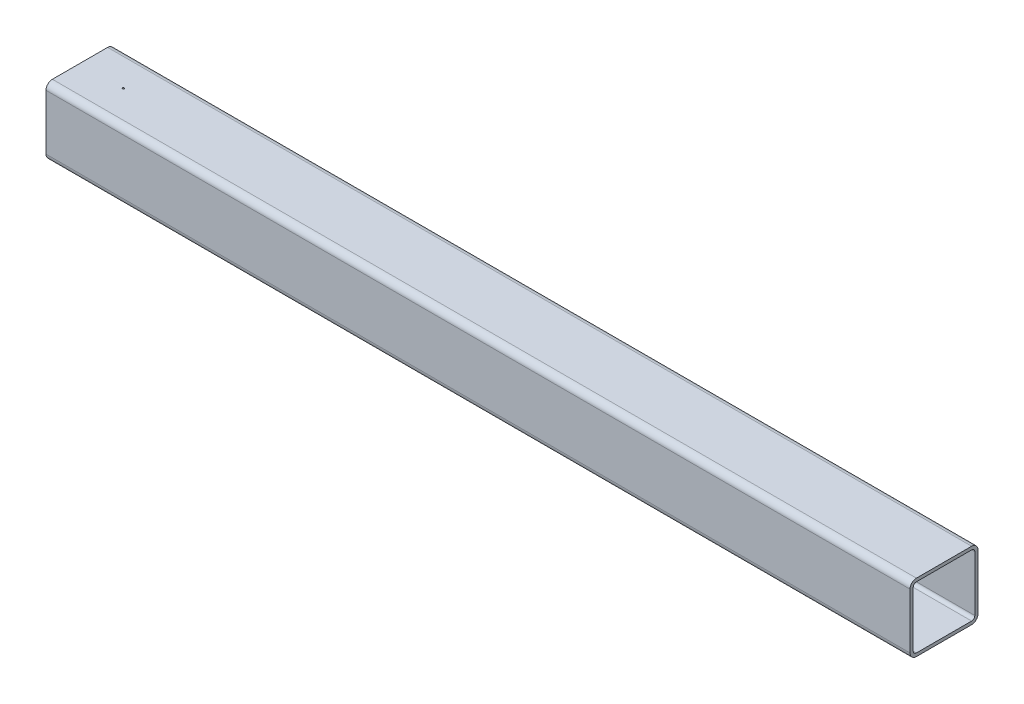
ISO-10303-21;
HEADER;
FILE_DESCRIPTION(('STEP AP214'),'2;1');
FILE_NAME('part.step','',(''),(''),'','','');
FILE_SCHEMA(('AUTOMOTIVE_DESIGN { 1 0 10303 214 1 1 1 1 }'));
ENDSEC;
DATA;
#1=APPLICATION_CONTEXT('core data for automotive mechanical design processes');
#2=APPLICATION_PROTOCOL_DEFINITION('international standard','automotive_design',2000,#1);
#3=PRODUCT_CONTEXT('',#1,'mechanical');
#4=PRODUCT('Part','Part','',(#3));
#5=PRODUCT_RELATED_PRODUCT_CATEGORY('part','',(#4));
#6=PRODUCT_DEFINITION_FORMATION('','',#4);
#7=PRODUCT_DEFINITION_CONTEXT('part definition',#1,'design');
#8=PRODUCT_DEFINITION('design','',#6,#7);
#9=PRODUCT_DEFINITION_SHAPE('','',#8);
#10=(LENGTH_UNIT() NAMED_UNIT(*) SI_UNIT(.MILLI.,.METRE.));
#11=(NAMED_UNIT(*) PLANE_ANGLE_UNIT() SI_UNIT($,.RADIAN.));
#12=(NAMED_UNIT(*) SI_UNIT($,.STERADIAN.) SOLID_ANGLE_UNIT());
#13=UNCERTAINTY_MEASURE_WITH_UNIT(LENGTH_MEASURE(1.E-05),#10,'distance_accuracy_value','');
#14=(GEOMETRIC_REPRESENTATION_CONTEXT(3) GLOBAL_UNCERTAINTY_ASSIGNED_CONTEXT((#13)) GLOBAL_UNIT_ASSIGNED_CONTEXT((#10,
#11,#12)) REPRESENTATION_CONTEXT('',''));
#15=CARTESIAN_POINT('',(0.,0.,0.));
#16=DIRECTION('',(0.,0.,1.));
#17=DIRECTION('',(1.,0.,0.));
#18=AXIS2_PLACEMENT_3D('',#15,#16,#17);
#19=CARTESIAN_POINT('',(1338.4276,-50.8000000000001,41.2750000000004));
#20=DIRECTION('',(0.,1.,0.));
#21=DIRECTION('',(0.,0.,1.));
#22=AXIS2_PLACEMENT_3D('',#19,#20,#21);
#23=PLANE('',#22);
#24=DIRECTION('',(0.,0.,-1.));
#25=VECTOR('',#24,1.);
#26=CARTESIAN_POINT('',(1105.7376,-50.8000000000001,41.2749999999999));
#27=LINE('',#26,#25);
#28=CARTESIAN_POINT('',(1105.7376,-50.8000000000001,41.2749999999999));
#29=VERTEX_POINT('',#28);
#30=CARTESIAN_POINT('',(1105.7376,-50.8,-41.2750000000002));
#31=VERTEX_POINT('',#30);
#32=EDGE_CURVE('E406',#29,#31,#27,.T.);
#33=ORIENTED_EDGE('',*,*,#32,.F.);
#34=DIRECTION('',(-1.,0.,0.));
#35=VECTOR('',#34,1.);
#36=CARTESIAN_POINT('',(1338.4276,-50.8000000000002,41.2750000000004));
#37=LINE('',#36,#35);
#38=CARTESIAN_POINT('',(-185.5724,-50.8000000000004,41.2749999999999));
#39=VERTEX_POINT('',#38);
#40=EDGE_CURVE('E164',#39,#29,#37,.F.);
#41=ORIENTED_EDGE('',*,*,#40,.F.);
#42=DIRECTION('',(0.,0.,-1.));
#43=VECTOR('',#42,1.);
#44=CARTESIAN_POINT('',(-185.5724,-50.8000000000003,41.2749999999999));
#45=LINE('',#44,#43);
#46=CARTESIAN_POINT('',(-185.5724,-50.8000000000004,-41.2749999999999));
#47=VERTEX_POINT('',#46);
#48=EDGE_CURVE('E176',#39,#47,#45,.T.);
#49=ORIENTED_EDGE('',*,*,#48,.T.);
#50=DIRECTION('',(-1.,0.,0.));
#51=VECTOR('',#50,1.);
#52=CARTESIAN_POINT('',(1338.4276,-50.8000000000001,-41.2750000000002));
#53=LINE('',#52,#51);
#54=EDGE_CURVE('E332',#31,#47,#53,.T.);
#55=ORIENTED_EDGE('',*,*,#54,.F.);
#56=EDGE_LOOP('',(#33,#41,#49,#55));
#57=FACE_BOUND('',#56,.T.);
#58=ADVANCED_FACE('F42',(#57),#23,.F.);
#59=CARTESIAN_POINT('',(1338.4276,-41.2750000000002,-41.2750000000002));
#60=DIRECTION('',(-1.,0.,0.));
#61=DIRECTION('',(0.,0.,1.));
#62=AXIS2_PLACEMENT_3D('',#59,#60,#61);
#63=CYLINDRICAL_SURFACE('',#62,9.525);
#64=DIRECTION('',(1.,0.,0.));
#65=VECTOR('',#64,1.);
#66=CARTESIAN_POINT('',(1338.4276,-41.2749999999999,-50.8000000000002));
#67=LINE('',#66,#65);
#68=CARTESIAN_POINT('',(-185.5724,-41.2750000000002,-50.8000000000002));
#69=VERTEX_POINT('',#68);
#70=CARTESIAN_POINT('',(1105.7376,-41.2749999999999,-50.8000000000004));
#71=VERTEX_POINT('',#70);
#72=EDGE_CURVE('E329',#69,#71,#67,.T.);
#73=ORIENTED_EDGE('',*,*,#72,.T.);
#74=CARTESIAN_POINT('',(1105.7376,-41.2750000000002,-41.2750000000002));
#75=DIRECTION('',(1.,0.,0.));
#76=DIRECTION('',(0.,0.,-1.));
#77=AXIS2_PLACEMENT_3D('',#74,#75,#76);
#78=CIRCLE('',#77,9.525);
#79=EDGE_CURVE('E404',#71,#31,#78,.F.);
#80=ORIENTED_EDGE('',*,*,#79,.T.);
#81=ORIENTED_EDGE('',*,*,#54,.T.);
#82=CARTESIAN_POINT('',(-185.5724,-41.2750000000004,-41.2749999999997));
#83=DIRECTION('',(-1.,0.,0.));
#84=DIRECTION('',(0.,0.,1.));
#85=AXIS2_PLACEMENT_3D('',#82,#83,#84);
#86=CIRCLE('',#85,9.525);
#87=EDGE_CURVE('E360',#47,#69,#86,.F.);
#88=ORIENTED_EDGE('',*,*,#87,.T.);
#89=EDGE_LOOP('',(#73,#80,#81,#88));
#90=FACE_BOUND('',#89,.T.);
#91=ADVANCED_FACE('F401',(#90),#63,.T.);
#92=CARTESIAN_POINT('',(1338.4276,41.2749999999997,-50.8));
#93=DIRECTION('',(0.,0.,1.));
#94=DIRECTION('',(0.,-1.,0.));
#95=AXIS2_PLACEMENT_3D('',#92,#93,#94);
#96=PLANE('',#95);
#97=DIRECTION('',(0.,1.,0.));
#98=VECTOR('',#97,1.);
#99=CARTESIAN_POINT('',(1105.7376,41.2749999999999,-50.8));
#100=LINE('',#99,#98);
#101=CARTESIAN_POINT('',(1105.7376,41.2749999999999,-50.8));
#102=VERTEX_POINT('',#101);
#103=EDGE_CURVE('E418',#71,#102,#100,.T.);
#104=ORIENTED_EDGE('',*,*,#103,.F.);
#105=ORIENTED_EDGE('',*,*,#72,.F.);
#106=DIRECTION('',(0.,1.,0.));
#107=VECTOR('',#106,1.);
#108=CARTESIAN_POINT('',(-185.572399999999,41.2749999999996,-50.8));
#109=LINE('',#108,#107);
#110=CARTESIAN_POINT('',(-185.5724,41.2749999999996,-50.8));
#111=VERTEX_POINT('',#110);
#112=EDGE_CURVE('E359',#69,#111,#109,.T.);
#113=ORIENTED_EDGE('',*,*,#112,.T.);
#114=DIRECTION('',(-1.,0.,0.));
#115=VECTOR('',#114,1.);
#116=CARTESIAN_POINT('',(1338.4276,41.2749999999997,-50.8));
#117=LINE('',#116,#115);
#118=EDGE_CURVE('E327',#102,#111,#117,.T.);
#119=ORIENTED_EDGE('',*,*,#118,.F.);
#120=EDGE_LOOP('',(#104,#105,#113,#119));
#121=FACE_BOUND('',#120,.T.);
#122=ADVANCED_FACE('F392',(#121),#96,.F.);
#123=CARTESIAN_POINT('',(1338.4276,41.2749999999998,-41.2749999999999));
#124=DIRECTION('',(-1.,0.,0.));
#125=DIRECTION('',(0.,0.,1.));
#126=AXIS2_PLACEMENT_3D('',#123,#124,#125);
#127=CYLINDRICAL_SURFACE('',#126,9.525);
#128=DIRECTION('',(1.,0.,0.));
#129=VECTOR('',#128,1.);
#130=CARTESIAN_POINT('',(1338.4276,50.8,-41.2749999999999));
#131=LINE('',#130,#129);
#132=CARTESIAN_POINT('',(-185.5724,50.7999999999995,-41.2750000000002));
#133=VERTEX_POINT('',#132);
#134=CARTESIAN_POINT('',(1105.7376,50.7999999999997,-41.2749999999999));
#135=VERTEX_POINT('',#134);
#136=EDGE_CURVE('E322',#133,#135,#131,.T.);
#137=ORIENTED_EDGE('',*,*,#136,.T.);
#138=CARTESIAN_POINT('',(1105.7376,41.2749999999999,-41.2750000000002));
#139=DIRECTION('',(1.,0.,0.));
#140=DIRECTION('',(0.,0.,-1.));
#141=AXIS2_PLACEMENT_3D('',#138,#139,#140);
#142=CIRCLE('',#141,9.525);
#143=EDGE_CURVE('E417',#135,#102,#142,.F.);
#144=ORIENTED_EDGE('',*,*,#143,.T.);
#145=ORIENTED_EDGE('',*,*,#118,.T.);
#146=CARTESIAN_POINT('',(-185.5724,41.2749999999997,-41.2750000000002));
#147=DIRECTION('',(-1.,0.,0.));
#148=DIRECTION('',(0.,0.,1.));
#149=AXIS2_PLACEMENT_3D('',#146,#147,#148);
#150=CIRCLE('',#149,9.525);
#151=EDGE_CURVE('E356',#111,#133,#150,.F.);
#152=ORIENTED_EDGE('',*,*,#151,.T.);
#153=EDGE_LOOP('',(#137,#144,#145,#152));
#154=FACE_BOUND('',#153,.T.);
#155=ADVANCED_FACE('F416',(#154),#127,.T.);
#156=CARTESIAN_POINT('',(1338.4276,50.7999999999996,41.2749999999999));
#157=DIRECTION('',(0.,-1.,0.));
#158=DIRECTION('',(0.,0.,-1.));
#159=AXIS2_PLACEMENT_3D('',#156,#157,#158);
#160=PLANE('',#159);
#161=CARTESIAN_POINT('',(-120.8024,50.7999999999998,0.));
#162=DIRECTION('',(0.,1.,0.));
#163=DIRECTION('',(0.,0.,1.));
#164=AXIS2_PLACEMENT_3D('',#161,#162,#163);
#165=CIRCLE('',#164,1.27000000000001);
#166=CARTESIAN_POINT('',(-120.8024,50.7999999999998,1.27000000000001));
#167=VERTEX_POINT('',#166);
#168=EDGE_CURVE('E326',#167,#167,#165,.T.);
#169=ORIENTED_EDGE('',*,*,#168,.F.);
#170=EDGE_LOOP('',(#169));
#171=FACE_BOUND('',#170,.T.);
#172=DIRECTION('',(0.,0.,1.));
#173=VECTOR('',#172,1.);
#174=CARTESIAN_POINT('',(1105.7376,50.7999999999997,41.2749999999999));
#175=LINE('',#174,#173);
#176=CARTESIAN_POINT('',(1105.7376,50.7999999999997,41.2749999999999));
#177=VERTEX_POINT('',#176);
#178=EDGE_CURVE('E413',#135,#177,#175,.T.);
#179=ORIENTED_EDGE('',*,*,#178,.F.);
#180=ORIENTED_EDGE('',*,*,#136,.F.);
#181=DIRECTION('',(0.,0.,-1.));
#182=VECTOR('',#181,1.);
#183=CARTESIAN_POINT('',(-185.5724,50.7999999999997,41.2749999999995));
#184=LINE('',#183,#182);
#185=CARTESIAN_POINT('',(-185.5724,50.7999999999997,41.2749999999995));
#186=VERTEX_POINT('',#185);
#187=EDGE_CURVE('E355',#133,#186,#184,.F.);
#188=ORIENTED_EDGE('',*,*,#187,.T.);
#189=DIRECTION('',(-1.,0.,0.));
#190=VECTOR('',#189,1.);
#191=CARTESIAN_POINT('',(1338.4276,50.7999999999996,41.2749999999999));
#192=LINE('',#191,#190);
#193=EDGE_CURVE('E303',#177,#186,#192,.T.);
#194=ORIENTED_EDGE('',*,*,#193,.F.);
#195=EDGE_LOOP('',(#179,#180,#188,#194));
#196=FACE_BOUND('',#195,.T.);
#197=ADVANCED_FACE('F412',(#171,#196),#160,.F.);
#198=CARTESIAN_POINT('',(1338.4276,46.0247999999999,41.2749999999999));
#199=DIRECTION('',(0.,-1.,0.));
#200=DIRECTION('',(0.,0.,-1.));
#201=AXIS2_PLACEMENT_3D('',#198,#199,#200);
#202=PLANE('',#201);
#203=DIRECTION('',(-1.,0.,0.));
#204=VECTOR('',#203,1.);
#205=CARTESIAN_POINT('',(1338.4276,46.0247999999999,-41.2750000000002));
#206=LINE('',#205,#204);
#207=CARTESIAN_POINT('',(-185.5724,46.0247999999995,-41.2750000000002));
#208=VERTEX_POINT('',#207);
#209=CARTESIAN_POINT('',(1105.7376,46.0248000000001,-41.2750000000002));
#210=VERTEX_POINT('',#209);
#211=EDGE_CURVE('E319',#208,#210,#206,.F.);
#212=ORIENTED_EDGE('',*,*,#211,.T.);
#213=DIRECTION('',(0.,0.,1.));
#214=VECTOR('',#213,1.);
#215=CARTESIAN_POINT('',(1105.7376,46.0247999999998,41.2749999999999));
#216=LINE('',#215,#214);
#217=CARTESIAN_POINT('',(1105.7376,46.0247999999998,41.2749999999999));
#218=VERTEX_POINT('',#217);
#219=EDGE_CURVE('E366',#210,#218,#216,.T.);
#220=ORIENTED_EDGE('',*,*,#219,.T.);
#221=DIRECTION('',(-1.,0.,0.));
#222=VECTOR('',#221,1.);
#223=CARTESIAN_POINT('',(1338.4276,46.0247999999999,41.2749999999999));
#224=LINE('',#223,#222);
#225=CARTESIAN_POINT('',(-185.5724,46.0247999999996,41.2749999999995));
#226=VERTEX_POINT('',#225);
#227=EDGE_CURVE('E301',#218,#226,#224,.T.);
#228=ORIENTED_EDGE('',*,*,#227,.T.);
#229=DIRECTION('',(0.,0.,-1.));
#230=VECTOR('',#229,1.);
#231=CARTESIAN_POINT('',(-185.5724,46.0247999999996,41.2749999999995));
#232=LINE('',#231,#230);
#233=EDGE_CURVE('E351',#226,#208,#232,.T.);
#234=ORIENTED_EDGE('',*,*,#233,.T.);
#235=EDGE_LOOP('',(#212,#220,#228,#234));
#236=FACE_BOUND('',#235,.T.);
#237=ADVANCED_FACE('F450',(#236),#202,.T.);
#238=CARTESIAN_POINT('',(1338.4276,41.2749999999998,-41.2749999999999));
#239=DIRECTION('',(-1.,0.,0.));
#240=DIRECTION('',(0.,0.,1.));
#241=AXIS2_PLACEMENT_3D('',#238,#239,#240);
#242=CYLINDRICAL_SURFACE('',#241,4.74979999999999);
#243=CARTESIAN_POINT('',(1105.7376,41.2749999999999,-41.2750000000002));
#244=DIRECTION('',(1.,0.,0.));
#245=DIRECTION('',(0.,0.,-1.));
#246=AXIS2_PLACEMENT_3D('',#243,#244,#245);
#247=CIRCLE('',#246,4.74979999999999);
#248=CARTESIAN_POINT('',(1105.7376,41.2749999999999,-46.0248000000001));
#249=VERTEX_POINT('',#248);
#250=EDGE_CURVE('E370',#210,#249,#247,.F.);
#251=ORIENTED_EDGE('',*,*,#250,.F.);
#252=ORIENTED_EDGE('',*,*,#211,.F.);
#253=CARTESIAN_POINT('',(-185.5724,41.2749999999997,-41.2750000000002));
#254=DIRECTION('',(-1.,0.,0.));
#255=DIRECTION('',(0.,0.,1.));
#256=AXIS2_PLACEMENT_3D('',#253,#254,#255);
#257=CIRCLE('',#256,4.74979999999999);
#258=CARTESIAN_POINT('',(-185.5724,41.2749999999997,-46.0248000000003));
#259=VERTEX_POINT('',#258);
#260=EDGE_CURVE('E348',#208,#259,#257,.T.);
#261=ORIENTED_EDGE('',*,*,#260,.T.);
#262=DIRECTION('',(1.,0.,0.));
#263=VECTOR('',#262,1.);
#264=CARTESIAN_POINT('',(1338.4276,41.2749999999995,-46.0248000000001));
#265=LINE('',#264,#263);
#266=EDGE_CURVE('E317',#249,#259,#265,.F.);
#267=ORIENTED_EDGE('',*,*,#266,.F.);
#268=EDGE_LOOP('',(#251,#252,#261,#267));
#269=FACE_BOUND('',#268,.T.);
#270=ADVANCED_FACE('F443',(#269),#242,.F.);
#271=CARTESIAN_POINT('',(1338.4276,41.2749999999995,-46.0248000000001));
#272=DIRECTION('',(0.,0.,1.));
#273=DIRECTION('',(0.,-1.,0.));
#274=AXIS2_PLACEMENT_3D('',#271,#272,#273);
#275=PLANE('',#274);
#276=DIRECTION('',(-1.,0.,0.));
#277=VECTOR('',#276,1.);
#278=CARTESIAN_POINT('',(1338.4276,-41.2749999999999,-46.0248000000001));
#279=LINE('',#278,#277);
#280=CARTESIAN_POINT('',(-185.5724,-41.2750000000002,-46.0247999999999));
#281=VERTEX_POINT('',#280);
#282=CARTESIAN_POINT('',(1105.7376,-41.2750000000004,-46.0248000000001));
#283=VERTEX_POINT('',#282);
#284=EDGE_CURVE('E314',#281,#283,#279,.F.);
#285=ORIENTED_EDGE('',*,*,#284,.T.);
#286=DIRECTION('',(0.,1.,0.));
#287=VECTOR('',#286,1.);
#288=CARTESIAN_POINT('',(1105.7376,41.2749999999999,-46.0248000000001));
#289=LINE('',#288,#287);
#290=EDGE_CURVE('E374',#283,#249,#289,.T.);
#291=ORIENTED_EDGE('',*,*,#290,.T.);
#292=ORIENTED_EDGE('',*,*,#266,.T.);
#293=DIRECTION('',(0.,1.,0.));
#294=VECTOR('',#293,1.);
#295=CARTESIAN_POINT('',(-185.5724,41.2749999999997,-46.0248000000003));
#296=LINE('',#295,#294);
#297=EDGE_CURVE('E347',#259,#281,#296,.F.);
#298=ORIENTED_EDGE('',*,*,#297,.T.);
#299=EDGE_LOOP('',(#285,#291,#292,#298));
#300=FACE_BOUND('',#299,.T.);
#301=ADVANCED_FACE('F438',(#300),#275,.T.);
#302=CARTESIAN_POINT('',(1338.4276,-41.2750000000002,-41.2750000000002));
#303=DIRECTION('',(-1.,0.,0.));
#304=DIRECTION('',(0.,0.,1.));
#305=AXIS2_PLACEMENT_3D('',#302,#303,#304);
#306=CYLINDRICAL_SURFACE('',#305,4.7498);
#307=CARTESIAN_POINT('',(1105.7376,-41.2750000000002,-41.2750000000002));
#308=DIRECTION('',(1.,0.,0.));
#309=DIRECTION('',(0.,0.,-1.));
#310=AXIS2_PLACEMENT_3D('',#307,#308,#309);
#311=CIRCLE('',#310,4.7498);
#312=CARTESIAN_POINT('',(1105.7376,-46.0248000000003,-41.2750000000004));
#313=VERTEX_POINT('',#312);
#314=EDGE_CURVE('E434',#283,#313,#311,.F.);
#315=ORIENTED_EDGE('',*,*,#314,.F.);
#316=ORIENTED_EDGE('',*,*,#284,.F.);
#317=CARTESIAN_POINT('',(-185.5724,-41.2750000000004,-41.2749999999997));
#318=DIRECTION('',(-1.,0.,0.));
#319=DIRECTION('',(0.,0.,1.));
#320=AXIS2_PLACEMENT_3D('',#317,#318,#319);
#321=CIRCLE('',#320,4.7498);
#322=CARTESIAN_POINT('',(-185.5724,-46.0248000000003,-41.2749999999999));
#323=VERTEX_POINT('',#322);
#324=EDGE_CURVE('E344',#281,#323,#321,.T.);
#325=ORIENTED_EDGE('',*,*,#324,.T.);
#326=DIRECTION('',(1.,0.,0.));
#327=VECTOR('',#326,1.);
#328=CARTESIAN_POINT('',(1338.4276,-46.0248000000003,-41.2750000000002));
#329=LINE('',#328,#327);
#330=EDGE_CURVE('E312',#313,#323,#329,.F.);
#331=ORIENTED_EDGE('',*,*,#330,.F.);
#332=EDGE_LOOP('',(#315,#316,#325,#331));
#333=FACE_BOUND('',#332,.T.);
#334=ADVANCED_FACE('F465',(#333),#306,.F.);
#335=CARTESIAN_POINT('',(1338.4276,-46.0248000000002,41.2749999999999));
#336=DIRECTION('',(0.,1.,0.));
#337=DIRECTION('',(0.,0.,1.));
#338=AXIS2_PLACEMENT_3D('',#335,#336,#337);
#339=PLANE('',#338);
#340=DIRECTION('',(-1.,0.,0.));
#341=VECTOR('',#340,1.);
#342=CARTESIAN_POINT('',(1338.4276,-46.0248000000002,41.2749999999999));
#343=LINE('',#342,#341);
#344=CARTESIAN_POINT('',(-185.5724,-46.0248000000002,41.2749999999999));
#345=VERTEX_POINT('',#344);
#346=CARTESIAN_POINT('',(1105.7376,-46.0248000000002,41.2749999999999));
#347=VERTEX_POINT('',#346);
#348=EDGE_CURVE('E309',#345,#347,#343,.F.);
#349=ORIENTED_EDGE('',*,*,#348,.T.);
#350=DIRECTION('',(0.,0.,-1.));
#351=VECTOR('',#350,1.);
#352=CARTESIAN_POINT('',(1105.7376,-46.0248000000002,41.2749999999999));
#353=LINE('',#352,#351);
#354=EDGE_CURVE('E431',#347,#313,#353,.T.);
#355=ORIENTED_EDGE('',*,*,#354,.T.);
#356=ORIENTED_EDGE('',*,*,#330,.T.);
#357=DIRECTION('',(0.,0.,-1.));
#358=VECTOR('',#357,1.);
#359=CARTESIAN_POINT('',(-185.5724,-46.0248000000002,41.2749999999999));
#360=LINE('',#359,#358);
#361=EDGE_CURVE('E343',#323,#345,#360,.F.);
#362=ORIENTED_EDGE('',*,*,#361,.T.);
#363=EDGE_LOOP('',(#349,#355,#356,#362));
#364=FACE_BOUND('',#363,.T.);
#365=ADVANCED_FACE('F462',(#364),#339,.T.);
#366=CARTESIAN_POINT('',(1338.4276,-41.2750000000003,41.2749999999999));
#367=DIRECTION('',(-1.,0.,0.));
#368=DIRECTION('',(0.,0.,1.));
#369=AXIS2_PLACEMENT_3D('',#366,#367,#368);
#370=CYLINDRICAL_SURFACE('',#369,4.74980000000001);
#371=CARTESIAN_POINT('',(1105.7376,-41.2750000000002,41.2749999999995));
#372=DIRECTION('',(1.,0.,0.));
#373=DIRECTION('',(0.,0.,-1.));
#374=AXIS2_PLACEMENT_3D('',#371,#372,#373);
#375=CIRCLE('',#374,4.74980000000001);
#376=CARTESIAN_POINT('',(1105.7376,-41.2750000000004,46.0247999999999));
#377=VERTEX_POINT('',#376);
#378=EDGE_CURVE('E429',#347,#377,#375,.F.);
#379=ORIENTED_EDGE('',*,*,#378,.F.);
#380=ORIENTED_EDGE('',*,*,#348,.F.);
#381=CARTESIAN_POINT('',(-185.5724,-41.2750000000006,41.2749999999999));
#382=DIRECTION('',(-1.,0.,0.));
#383=DIRECTION('',(0.,0.,1.));
#384=AXIS2_PLACEMENT_3D('',#381,#382,#383);
#385=CIRCLE('',#384,4.74980000000001);
#386=CARTESIAN_POINT('',(-185.5724,-41.2750000000003,46.0247999999999));
#387=VERTEX_POINT('',#386);
#388=EDGE_CURVE('E340',#345,#387,#385,.T.);
#389=ORIENTED_EDGE('',*,*,#388,.T.);
#390=DIRECTION('',(-1.,0.,0.));
#391=VECTOR('',#390,1.);
#392=CARTESIAN_POINT('',(1338.4276,-41.2750000000003,46.0247999999999));
#393=LINE('',#392,#391);
#394=EDGE_CURVE('E307',#377,#387,#393,.T.);
#395=ORIENTED_EDGE('',*,*,#394,.F.);
#396=EDGE_LOOP('',(#379,#380,#389,#395));
#397=FACE_BOUND('',#396,.T.);
#398=ADVANCED_FACE('F459',(#397),#370,.F.);
#399=CARTESIAN_POINT('',(1338.4276,41.2749999999997,46.0247999999999));
#400=DIRECTION('',(0.,0.,-1.));
#401=DIRECTION('',(-1.,0.,0.));
#402=AXIS2_PLACEMENT_3D('',#399,#400,#401);
#403=PLANE('',#402);
#404=DIRECTION('',(-1.,0.,0.));
#405=VECTOR('',#404,1.);
#406=CARTESIAN_POINT('',(1338.4276,41.2749999999997,46.0247999999999));
#407=LINE('',#406,#405);
#408=CARTESIAN_POINT('',(-185.5724,41.2749999999998,46.0247999999999));
#409=VERTEX_POINT('',#408);
#410=CARTESIAN_POINT('',(1105.7376,41.2750000000001,46.0247999999999));
#411=VERTEX_POINT('',#410);
#412=EDGE_CURVE('E304',#409,#411,#407,.F.);
#413=ORIENTED_EDGE('',*,*,#412,.T.);
#414=DIRECTION('',(0.,-1.,0.));
#415=VECTOR('',#414,1.);
#416=CARTESIAN_POINT('',(1105.7376,41.2750000000001,46.0247999999999));
#417=LINE('',#416,#415);
#418=EDGE_CURVE('E57',#411,#377,#417,.T.);
#419=ORIENTED_EDGE('',*,*,#418,.T.);
#420=ORIENTED_EDGE('',*,*,#394,.T.);
#421=DIRECTION('',(0.,1.,0.));
#422=VECTOR('',#421,1.);
#423=CARTESIAN_POINT('',(-185.5724,41.2749999999998,46.0247999999999));
#424=LINE('',#423,#422);
#425=EDGE_CURVE('E339',#387,#409,#424,.T.);
#426=ORIENTED_EDGE('',*,*,#425,.T.);
#427=EDGE_LOOP('',(#413,#419,#420,#426));
#428=FACE_BOUND('',#427,.T.);
#429=ADVANCED_FACE('F455',(#428),#403,.T.);
#430=CARTESIAN_POINT('',(1338.4276,41.2749999999996,41.2749999999999));
#431=DIRECTION('',(-1.,0.,0.));
#432=DIRECTION('',(0.,0.,1.));
#433=AXIS2_PLACEMENT_3D('',#430,#431,#432);
#434=CYLINDRICAL_SURFACE('',#433,4.7498);
#435=CARTESIAN_POINT('',(1105.7376,41.2749999999997,41.2750000000004));
#436=DIRECTION('',(1.,0.,0.));
#437=DIRECTION('',(0.,0.,-1.));
#438=AXIS2_PLACEMENT_3D('',#435,#436,#437);
#439=CIRCLE('',#438,4.7498);
#440=EDGE_CURVE('E426',#411,#218,#439,.F.);
#441=ORIENTED_EDGE('',*,*,#440,.F.);
#442=ORIENTED_EDGE('',*,*,#412,.F.);
#443=CARTESIAN_POINT('',(-185.5724,41.2749999999996,41.2749999999999));
#444=DIRECTION('',(-1.,0.,0.));
#445=DIRECTION('',(0.,0.,1.));
#446=AXIS2_PLACEMENT_3D('',#443,#444,#445);
#447=CIRCLE('',#446,4.7498);
#448=EDGE_CURVE('E172',#409,#226,#447,.T.);
#449=ORIENTED_EDGE('',*,*,#448,.T.);
#450=ORIENTED_EDGE('',*,*,#227,.F.);
#451=EDGE_LOOP('',(#441,#442,#449,#450));
#452=FACE_BOUND('',#451,.T.);
#453=ADVANCED_FACE('F452',(#452),#434,.F.);
#454=CARTESIAN_POINT('',(1338.4276,41.2749999999996,41.2749999999999));
#455=DIRECTION('',(-1.,0.,0.));
#456=DIRECTION('',(0.,0.,1.));
#457=AXIS2_PLACEMENT_3D('',#454,#455,#456);
#458=CYLINDRICAL_SURFACE('',#457,9.525);
#459=DIRECTION('',(-1.,0.,0.));
#460=VECTOR('',#459,1.);
#461=CARTESIAN_POINT('',(1338.4276,41.2749999999998,50.8));
#462=LINE('',#461,#460);
#463=CARTESIAN_POINT('',(-185.5724,41.2749999999996,50.8000000000004));
#464=VERTEX_POINT('',#463);
#465=CARTESIAN_POINT('',(1105.7376,41.2749999999997,50.8000000000004));
#466=VERTEX_POINT('',#465);
#467=EDGE_CURVE('E169',#464,#466,#462,.F.);
#468=ORIENTED_EDGE('',*,*,#467,.T.);
#469=CARTESIAN_POINT('',(1105.7376,41.2749999999997,41.2750000000004));
#470=DIRECTION('',(1.,0.,0.));
#471=DIRECTION('',(0.,0.,-1.));
#472=AXIS2_PLACEMENT_3D('',#469,#470,#471);
#473=CIRCLE('',#472,9.525);
#474=EDGE_CURVE('E64',#466,#177,#473,.F.);
#475=ORIENTED_EDGE('',*,*,#474,.T.);
#476=ORIENTED_EDGE('',*,*,#193,.T.);
#477=CARTESIAN_POINT('',(-185.5724,41.2749999999996,41.2749999999999));
#478=DIRECTION('',(-1.,0.,0.));
#479=DIRECTION('',(0.,0.,1.));
#480=AXIS2_PLACEMENT_3D('',#477,#478,#479);
#481=CIRCLE('',#480,9.525);
#482=EDGE_CURVE('E352',#186,#464,#481,.F.);
#483=ORIENTED_EDGE('',*,*,#482,.T.);
#484=EDGE_LOOP('',(#468,#475,#476,#483));
#485=FACE_BOUND('',#484,.T.);
#486=ADVANCED_FACE('F574',(#485),#458,.T.);
#487=CARTESIAN_POINT('',(1338.4276,-41.2750000000003,41.2749999999999));
#488=DIRECTION('',(-1.,0.,0.));
#489=DIRECTION('',(0.,0.,1.));
#490=AXIS2_PLACEMENT_3D('',#487,#488,#489);
#491=CYLINDRICAL_SURFACE('',#490,9.52500000000001);
#492=ORIENTED_EDGE('',*,*,#40,.T.);
#493=CARTESIAN_POINT('',(1105.7376,-41.2750000000002,41.2749999999995));
#494=DIRECTION('',(1.,0.,0.));
#495=DIRECTION('',(0.,0.,-1.));
#496=AXIS2_PLACEMENT_3D('',#493,#494,#495);
#497=CIRCLE('',#496,9.52500000000001);
#498=CARTESIAN_POINT('',(1105.7376,-41.2750000000002,50.7999999999995));
#499=VERTEX_POINT('',#498);
#500=EDGE_CURVE('E153',#29,#499,#497,.F.);
#501=ORIENTED_EDGE('',*,*,#500,.T.);
#502=DIRECTION('',(-1.,0.,0.));
#503=VECTOR('',#502,1.);
#504=CARTESIAN_POINT('',(1338.4276,-41.2750000000005,50.8));
#505=LINE('',#504,#503);
#506=CARTESIAN_POINT('',(-185.5724,-41.2750000000003,50.8));
#507=VERTEX_POINT('',#506);
#508=EDGE_CURVE('E162',#499,#507,#505,.T.);
#509=ORIENTED_EDGE('',*,*,#508,.T.);
#510=CARTESIAN_POINT('',(-185.5724,-41.2750000000006,41.2749999999999));
#511=DIRECTION('',(-1.,0.,0.));
#512=DIRECTION('',(0.,0.,1.));
#513=AXIS2_PLACEMENT_3D('',#510,#511,#512);
#514=CIRCLE('',#513,9.52500000000001);
#515=EDGE_CURVE('E336',#507,#39,#514,.F.);
#516=ORIENTED_EDGE('',*,*,#515,.T.);
#517=EDGE_LOOP('',(#492,#501,#509,#516));
#518=FACE_BOUND('',#517,.T.);
#519=ADVANCED_FACE('F160',(#518),#491,.T.);
#520=CARTESIAN_POINT('',(1338.4276,41.2749999999998,50.8));
#521=DIRECTION('',(0.,0.,-1.));
#522=DIRECTION('',(-1.,0.,0.));
#523=AXIS2_PLACEMENT_3D('',#520,#521,#522);
#524=PLANE('',#523);
#525=DIRECTION('',(0.,-1.,0.));
#526=VECTOR('',#525,1.);
#527=CARTESIAN_POINT('',(1105.7376,41.2749999999997,50.8000000000004));
#528=LINE('',#527,#526);
#529=EDGE_CURVE('E12',#466,#499,#528,.T.);
#530=ORIENTED_EDGE('',*,*,#529,.F.);
#531=ORIENTED_EDGE('',*,*,#467,.F.);
#532=DIRECTION('',(0.,1.,0.));
#533=VECTOR('',#532,1.);
#534=CARTESIAN_POINT('',(-185.5724,41.2749999999996,50.8000000000004));
#535=LINE('',#534,#533);
#536=EDGE_CURVE('E50',#507,#464,#535,.T.);
#537=ORIENTED_EDGE('',*,*,#536,.F.);
#538=ORIENTED_EDGE('',*,*,#508,.F.);
#539=EDGE_LOOP('',(#530,#531,#537,#538));
#540=FACE_BOUND('',#539,.T.);
#541=ADVANCED_FACE('F167',(#540),#524,.F.);
#542=CARTESIAN_POINT('',(-120.8024,48.2599999999999,0.));
#543=DIRECTION('',(0.,1.,0.));
#544=DIRECTION('',(0.,0.,1.));
#545=AXIS2_PLACEMENT_3D('',#542,#543,#544);
#546=PLANE('',#545);
#547=CARTESIAN_POINT('',(-120.8024,48.2599999999999,0.));
#548=DIRECTION('',(0.,1.,0.));
#549=DIRECTION('',(0.,0.,1.));
#550=AXIS2_PLACEMENT_3D('',#547,#548,#549);
#551=CIRCLE('',#550,1.27000000000001);
#552=CARTESIAN_POINT('',(-120.8024,48.2599999999999,1.27000000000001));
#553=VERTEX_POINT('',#552);
#554=EDGE_CURVE('E334',#553,#553,#551,.T.);
#555=ORIENTED_EDGE('',*,*,#554,.T.);
#556=EDGE_LOOP('',(#555));
#557=FACE_BOUND('',#556,.T.);
#558=ADVANCED_FACE('F44',(#557),#546,.T.);
#559=CARTESIAN_POINT('',(-120.8024,48.2599999999999,0.));
#560=DIRECTION('',(0.,1.,0.));
#561=DIRECTION('',(0.,0.,1.));
#562=AXIS2_PLACEMENT_3D('',#559,#560,#561);
#563=CYLINDRICAL_SURFACE('',#562,1.27000000000001);
#564=ORIENTED_EDGE('',*,*,#554,.F.);
#565=EDGE_LOOP('',(#564));
#566=FACE_BOUND('',#565,.T.);
#567=ORIENTED_EDGE('',*,*,#168,.T.);
#568=EDGE_LOOP('',(#567));
#569=FACE_BOUND('',#568,.T.);
#570=ADVANCED_FACE('F472',(#566,#569),#563,.F.);
#571=CARTESIAN_POINT('',(-185.5724,41.2749999999998,41.2749999999995));
#572=DIRECTION('',(1.,0.,0.));
#573=DIRECTION('',(0.,0.,-1.));
#574=AXIS2_PLACEMENT_3D('',#571,#572,#573);
#575=PLANE('',#574);
#576=ORIENTED_EDGE('',*,*,#425,.F.);
#577=ORIENTED_EDGE('',*,*,#388,.F.);
#578=ORIENTED_EDGE('',*,*,#361,.F.);
#579=ORIENTED_EDGE('',*,*,#324,.F.);
#580=ORIENTED_EDGE('',*,*,#297,.F.);
#581=ORIENTED_EDGE('',*,*,#260,.F.);
#582=ORIENTED_EDGE('',*,*,#233,.F.);
#583=ORIENTED_EDGE('',*,*,#448,.F.);
#584=EDGE_LOOP('',(#576,#577,#578,#579,#580,#581,#582,#583));
#585=FACE_BOUND('',#584,.T.);
#586=ORIENTED_EDGE('',*,*,#187,.F.);
#587=ORIENTED_EDGE('',*,*,#151,.F.);
#588=ORIENTED_EDGE('',*,*,#112,.F.);
#589=ORIENTED_EDGE('',*,*,#87,.F.);
#590=ORIENTED_EDGE('',*,*,#48,.F.);
#591=ORIENTED_EDGE('',*,*,#515,.F.);
#592=ORIENTED_EDGE('',*,*,#536,.T.);
#593=ORIENTED_EDGE('',*,*,#482,.F.);
#594=EDGE_LOOP('',(#586,#587,#588,#589,#590,#591,#592,#593));
#595=FACE_BOUND('',#594,.T.);
#596=ADVANCED_FACE('F397',(#585,#595),#575,.F.);
#597=CARTESIAN_POINT('',(1105.7376,-2.22044604925031E-13,0.));
#598=DIRECTION('',(1.,0.,0.));
#599=DIRECTION('',(0.,0.,-1.));
#600=AXIS2_PLACEMENT_3D('',#597,#598,#599);
#601=PLANE('',#600);
#602=ORIENTED_EDGE('',*,*,#250,.T.);
#603=ORIENTED_EDGE('',*,*,#290,.F.);
#604=ORIENTED_EDGE('',*,*,#314,.T.);
#605=ORIENTED_EDGE('',*,*,#354,.F.);
#606=ORIENTED_EDGE('',*,*,#378,.T.);
#607=ORIENTED_EDGE('',*,*,#418,.F.);
#608=ORIENTED_EDGE('',*,*,#440,.T.);
#609=ORIENTED_EDGE('',*,*,#219,.F.);
#610=EDGE_LOOP('',(#602,#603,#604,#605,#606,#607,#608,#609));
#611=FACE_BOUND('',#610,.T.);
#612=ORIENTED_EDGE('',*,*,#32,.T.);
#613=ORIENTED_EDGE('',*,*,#79,.F.);
#614=ORIENTED_EDGE('',*,*,#103,.T.);
#615=ORIENTED_EDGE('',*,*,#143,.F.);
#616=ORIENTED_EDGE('',*,*,#178,.T.);
#617=ORIENTED_EDGE('',*,*,#474,.F.);
#618=ORIENTED_EDGE('',*,*,#529,.T.);
#619=ORIENTED_EDGE('',*,*,#500,.F.);
#620=EDGE_LOOP('',(#612,#613,#614,#615,#616,#617,#618,#619));
#621=FACE_BOUND('',#620,.T.);
#622=ADVANCED_FACE('F152',(#611,#621),#601,.T.);
#623=CLOSED_SHELL('',(#58,#91,#122,#155,#197,#237,#270,#301,#334,#365,#398,#429,#453,#486,#519,
#541,#558,#570,#596,#622));
#624=MANIFOLD_SOLID_BREP('B2',#623);
#625=ADVANCED_BREP_SHAPE_REPRESENTATION('',(#18,#624),#14);
#626=SHAPE_DEFINITION_REPRESENTATION(#9,#625);
ENDSEC;
END-ISO-10303-21;
